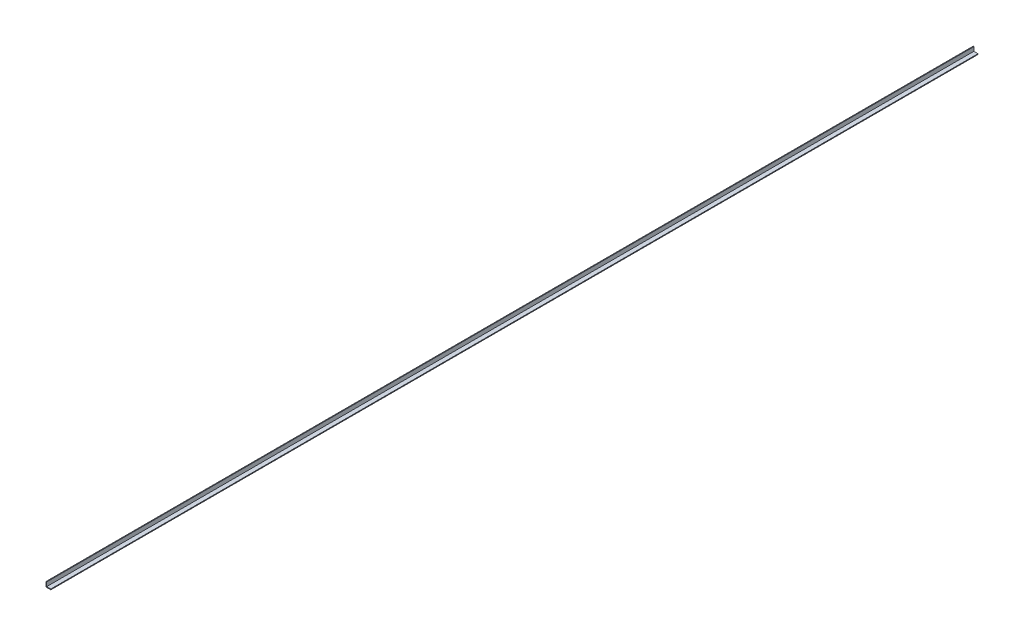
ISO-10303-21;
HEADER;
FILE_DESCRIPTION(('STEP AP214'),'2;1');
FILE_NAME('part.step','',(''),(''),'','','');
FILE_SCHEMA(('AUTOMOTIVE_DESIGN { 1 0 10303 214 1 1 1 1 }'));
ENDSEC;
DATA;
#1=APPLICATION_CONTEXT('core data for automotive mechanical design processes');
#2=APPLICATION_PROTOCOL_DEFINITION('international standard','automotive_design',2000,#1);
#3=PRODUCT_CONTEXT('',#1,'mechanical');
#4=PRODUCT('Part','Part','',(#3));
#5=PRODUCT_RELATED_PRODUCT_CATEGORY('part','',(#4));
#6=PRODUCT_DEFINITION_FORMATION('','',#4);
#7=PRODUCT_DEFINITION_CONTEXT('part definition',#1,'design');
#8=PRODUCT_DEFINITION('design','',#6,#7);
#9=PRODUCT_DEFINITION_SHAPE('','',#8);
#10=(LENGTH_UNIT() NAMED_UNIT(*) SI_UNIT(.MILLI.,.METRE.));
#11=(NAMED_UNIT(*) PLANE_ANGLE_UNIT() SI_UNIT($,.RADIAN.));
#12=(NAMED_UNIT(*) SI_UNIT($,.STERADIAN.) SOLID_ANGLE_UNIT());
#13=UNCERTAINTY_MEASURE_WITH_UNIT(LENGTH_MEASURE(1.E-05),#10,'distance_accuracy_value','');
#14=(GEOMETRIC_REPRESENTATION_CONTEXT(3) GLOBAL_UNCERTAINTY_ASSIGNED_CONTEXT((#13)) GLOBAL_UNIT_ASSIGNED_CONTEXT((#10,
#11,#12)) REPRESENTATION_CONTEXT('',''));
#15=CARTESIAN_POINT('',(0.,0.,0.));
#16=DIRECTION('',(0.,0.,1.));
#17=DIRECTION('',(1.,0.,0.));
#18=AXIS2_PLACEMENT_3D('',#15,#16,#17);
#19=CARTESIAN_POINT('',(4.76,31.75,-6100.));
#20=DIRECTION('',(0.,1.,0.));
#21=DIRECTION('',(0.,0.,1.));
#22=AXIS2_PLACEMENT_3D('',#19,#20,#21);
#23=PLANE('',#22);
#24=DIRECTION('',(-1.,0.,0.));
#25=VECTOR('',#24,1.);
#26=CARTESIAN_POINT('',(4.76,31.75,0.));
#27=LINE('',#26,#25);
#28=CARTESIAN_POINT('',(4.76,31.75,0.));
#29=VERTEX_POINT('',#28);
#30=CARTESIAN_POINT('',(0.,31.75,0.));
#31=VERTEX_POINT('',#30);
#32=EDGE_CURVE('E118',#29,#31,#27,.T.);
#33=ORIENTED_EDGE('',*,*,#32,.F.);
#34=DIRECTION('',(0.,0.,1.));
#35=VECTOR('',#34,1.);
#36=CARTESIAN_POINT('',(4.76,31.75,-6100.));
#37=LINE('',#36,#35);
#38=CARTESIAN_POINT('',(4.76,31.75,-6100.));
#39=VERTEX_POINT('',#38);
#40=EDGE_CURVE('E11',#39,#29,#37,.T.);
#41=ORIENTED_EDGE('',*,*,#40,.F.);
#42=DIRECTION('',(-1.,0.,0.));
#43=VECTOR('',#42,1.);
#44=CARTESIAN_POINT('',(4.76,31.75,-6100.));
#45=LINE('',#44,#43);
#46=CARTESIAN_POINT('',(0.,31.75,-6100.));
#47=VERTEX_POINT('',#46);
#48=EDGE_CURVE('E132',#39,#47,#45,.T.);
#49=ORIENTED_EDGE('',*,*,#48,.T.);
#50=DIRECTION('',(0.,0.,1.));
#51=VECTOR('',#50,1.);
#52=CARTESIAN_POINT('',(0.,31.75,-6100.));
#53=LINE('',#52,#51);
#54=EDGE_CURVE('E36',#47,#31,#53,.T.);
#55=ORIENTED_EDGE('',*,*,#54,.T.);
#56=EDGE_LOOP('',(#33,#41,#49,#55));
#57=FACE_BOUND('',#56,.T.);
#58=ADVANCED_FACE('F33',(#57),#23,.T.);
#59=CARTESIAN_POINT('',(4.76,4.76,-6100.));
#60=DIRECTION('',(1.,0.,0.));
#61=DIRECTION('',(0.,1.,0.));
#62=AXIS2_PLACEMENT_3D('',#59,#60,#61);
#63=PLANE('',#62);
#64=DIRECTION('',(0.,1.,0.));
#65=VECTOR('',#64,1.);
#66=CARTESIAN_POINT('',(4.76,4.76,0.));
#67=LINE('',#66,#65);
#68=CARTESIAN_POINT('',(4.76,4.76,0.));
#69=VERTEX_POINT('',#68);
#70=EDGE_CURVE('E130',#69,#29,#67,.T.);
#71=ORIENTED_EDGE('',*,*,#70,.F.);
#72=DIRECTION('',(0.,0.,1.));
#73=VECTOR('',#72,1.);
#74=CARTESIAN_POINT('',(4.76,4.76,-6100.));
#75=LINE('',#74,#73);
#76=CARTESIAN_POINT('',(4.76,4.76,-6100.));
#77=VERTEX_POINT('',#76);
#78=EDGE_CURVE('E42',#77,#69,#75,.T.);
#79=ORIENTED_EDGE('',*,*,#78,.F.);
#80=DIRECTION('',(0.,1.,0.));
#81=VECTOR('',#80,1.);
#82=CARTESIAN_POINT('',(4.76,4.76,-6100.));
#83=LINE('',#82,#81);
#84=EDGE_CURVE('E108',#77,#39,#83,.T.);
#85=ORIENTED_EDGE('',*,*,#84,.T.);
#86=ORIENTED_EDGE('',*,*,#40,.T.);
#87=EDGE_LOOP('',(#71,#79,#85,#86));
#88=FACE_BOUND('',#87,.T.);
#89=ADVANCED_FACE('F140',(#88),#63,.T.);
#90=CARTESIAN_POINT('',(31.75,4.76,-6100.));
#91=DIRECTION('',(0.,1.,0.));
#92=DIRECTION('',(-1.,0.,0.));
#93=AXIS2_PLACEMENT_3D('',#90,#91,#92);
#94=PLANE('',#93);
#95=DIRECTION('',(-1.,0.,0.));
#96=VECTOR('',#95,1.);
#97=CARTESIAN_POINT('',(31.75,4.76,0.));
#98=LINE('',#97,#96);
#99=CARTESIAN_POINT('',(31.75,4.76,0.));
#100=VERTEX_POINT('',#99);
#101=EDGE_CURVE('E95',#100,#69,#98,.T.);
#102=ORIENTED_EDGE('',*,*,#101,.F.);
#103=DIRECTION('',(0.,0.,1.));
#104=VECTOR('',#103,1.);
#105=CARTESIAN_POINT('',(31.75,4.76,-6100.));
#106=LINE('',#105,#104);
#107=CARTESIAN_POINT('',(31.75,4.76,-6100.));
#108=VERTEX_POINT('',#107);
#109=EDGE_CURVE('E90',#108,#100,#106,.T.);
#110=ORIENTED_EDGE('',*,*,#109,.F.);
#111=DIRECTION('',(-1.,0.,0.));
#112=VECTOR('',#111,1.);
#113=CARTESIAN_POINT('',(31.75,4.76,-6100.));
#114=LINE('',#113,#112);
#115=EDGE_CURVE('E93',#108,#77,#114,.T.);
#116=ORIENTED_EDGE('',*,*,#115,.T.);
#117=ORIENTED_EDGE('',*,*,#78,.T.);
#118=EDGE_LOOP('',(#102,#110,#116,#117));
#119=FACE_BOUND('',#118,.T.);
#120=ADVANCED_FACE('F92',(#119),#94,.T.);
#121=CARTESIAN_POINT('',(31.75,0.,-6100.));
#122=DIRECTION('',(1.,0.,0.));
#123=DIRECTION('',(0.,0.,-1.));
#124=AXIS2_PLACEMENT_3D('',#121,#122,#123);
#125=PLANE('',#124);
#126=DIRECTION('',(0.,1.,0.));
#127=VECTOR('',#126,1.);
#128=CARTESIAN_POINT('',(31.75,0.,0.));
#129=LINE('',#128,#127);
#130=CARTESIAN_POINT('',(31.75,0.,0.));
#131=VERTEX_POINT('',#130);
#132=EDGE_CURVE('E127',#131,#100,#129,.T.);
#133=ORIENTED_EDGE('',*,*,#132,.F.);
#134=DIRECTION('',(0.,0.,1.));
#135=VECTOR('',#134,1.);
#136=CARTESIAN_POINT('',(31.75,0.,-6100.));
#137=LINE('',#136,#135);
#138=CARTESIAN_POINT('',(31.75,0.,-6100.));
#139=VERTEX_POINT('',#138);
#140=EDGE_CURVE('E100',#139,#131,#137,.T.);
#141=ORIENTED_EDGE('',*,*,#140,.F.);
#142=DIRECTION('',(0.,1.,0.));
#143=VECTOR('',#142,1.);
#144=CARTESIAN_POINT('',(31.75,0.,-6100.));
#145=LINE('',#144,#143);
#146=EDGE_CURVE('E106',#139,#108,#145,.T.);
#147=ORIENTED_EDGE('',*,*,#146,.T.);
#148=ORIENTED_EDGE('',*,*,#109,.T.);
#149=EDGE_LOOP('',(#133,#141,#147,#148));
#150=FACE_BOUND('',#149,.T.);
#151=ADVANCED_FACE('F110',(#150),#125,.T.);
#152=CARTESIAN_POINT('',(0.,0.,-6100.));
#153=DIRECTION('',(0.,-1.,0.));
#154=DIRECTION('',(0.,0.,-1.));
#155=AXIS2_PLACEMENT_3D('',#152,#153,#154);
#156=PLANE('',#155);
#157=DIRECTION('',(1.,0.,0.));
#158=VECTOR('',#157,1.);
#159=CARTESIAN_POINT('',(0.,0.,0.));
#160=LINE('',#159,#158);
#161=CARTESIAN_POINT('',(0.,0.,0.));
#162=VERTEX_POINT('',#161);
#163=EDGE_CURVE('E124',#162,#131,#160,.T.);
#164=ORIENTED_EDGE('',*,*,#163,.F.);
#165=DIRECTION('',(0.,0.,1.));
#166=VECTOR('',#165,1.);
#167=CARTESIAN_POINT('',(0.,0.,-6100.));
#168=LINE('',#167,#166);
#169=CARTESIAN_POINT('',(0.,0.,-6100.));
#170=VERTEX_POINT('',#169);
#171=EDGE_CURVE('E135',#170,#162,#168,.T.);
#172=ORIENTED_EDGE('',*,*,#171,.F.);
#173=DIRECTION('',(1.,0.,0.));
#174=VECTOR('',#173,1.);
#175=CARTESIAN_POINT('',(0.,0.,-6100.));
#176=LINE('',#175,#174);
#177=EDGE_CURVE('E111',#170,#139,#176,.T.);
#178=ORIENTED_EDGE('',*,*,#177,.T.);
#179=ORIENTED_EDGE('',*,*,#140,.T.);
#180=EDGE_LOOP('',(#164,#172,#178,#179));
#181=FACE_BOUND('',#180,.T.);
#182=ADVANCED_FACE('F153',(#181),#156,.T.);
#183=CARTESIAN_POINT('',(0.,31.75,-6100.));
#184=DIRECTION('',(-1.,0.,0.));
#185=DIRECTION('',(0.,-1.,0.));
#186=AXIS2_PLACEMENT_3D('',#183,#184,#185);
#187=PLANE('',#186);
#188=DIRECTION('',(0.,-1.,0.));
#189=VECTOR('',#188,1.);
#190=CARTESIAN_POINT('',(0.,31.75,0.));
#191=LINE('',#190,#189);
#192=EDGE_CURVE('E121',#31,#162,#191,.T.);
#193=ORIENTED_EDGE('',*,*,#192,.F.);
#194=ORIENTED_EDGE('',*,*,#54,.F.);
#195=DIRECTION('',(0.,-1.,0.));
#196=VECTOR('',#195,1.);
#197=CARTESIAN_POINT('',(0.,31.75,-6100.));
#198=LINE('',#197,#196);
#199=EDGE_CURVE('E113',#47,#170,#198,.T.);
#200=ORIENTED_EDGE('',*,*,#199,.T.);
#201=ORIENTED_EDGE('',*,*,#171,.T.);
#202=EDGE_LOOP('',(#193,#194,#200,#201));
#203=FACE_BOUND('',#202,.T.);
#204=ADVANCED_FACE('F137',(#203),#187,.T.);
#205=CARTESIAN_POINT('',(0.,0.,-6100.));
#206=DIRECTION('',(0.,0.,1.));
#207=DIRECTION('',(1.,0.,0.));
#208=AXIS2_PLACEMENT_3D('',#205,#206,#207);
#209=PLANE('',#208);
#210=ORIENTED_EDGE('',*,*,#48,.F.);
#211=ORIENTED_EDGE('',*,*,#84,.F.);
#212=ORIENTED_EDGE('',*,*,#115,.F.);
#213=ORIENTED_EDGE('',*,*,#146,.F.);
#214=ORIENTED_EDGE('',*,*,#177,.F.);
#215=ORIENTED_EDGE('',*,*,#199,.F.);
#216=EDGE_LOOP('',(#210,#211,#212,#213,#214,#215));
#217=FACE_BOUND('',#216,.T.);
#218=ADVANCED_FACE('F104',(#217),#209,.F.);
#219=CARTESIAN_POINT('',(0.,0.,0.));
#220=DIRECTION('',(0.,0.,1.));
#221=DIRECTION('',(1.,0.,0.));
#222=AXIS2_PLACEMENT_3D('',#219,#220,#221);
#223=PLANE('',#222);
#224=ORIENTED_EDGE('',*,*,#32,.T.);
#225=ORIENTED_EDGE('',*,*,#192,.T.);
#226=ORIENTED_EDGE('',*,*,#163,.T.);
#227=ORIENTED_EDGE('',*,*,#132,.T.);
#228=ORIENTED_EDGE('',*,*,#101,.T.);
#229=ORIENTED_EDGE('',*,*,#70,.T.);
#230=EDGE_LOOP('',(#224,#225,#226,#227,#228,#229));
#231=FACE_BOUND('',#230,.T.);
#232=ADVANCED_FACE('F139',(#231),#223,.T.);
#233=CLOSED_SHELL('',(#58,#89,#120,#151,#182,#204,#218,#232));
#234=MANIFOLD_SOLID_BREP('B2',#233);
#235=ADVANCED_BREP_SHAPE_REPRESENTATION('',(#18,#234),#14);
#236=SHAPE_DEFINITION_REPRESENTATION(#9,#235);
ENDSEC;
END-ISO-10303-21;
